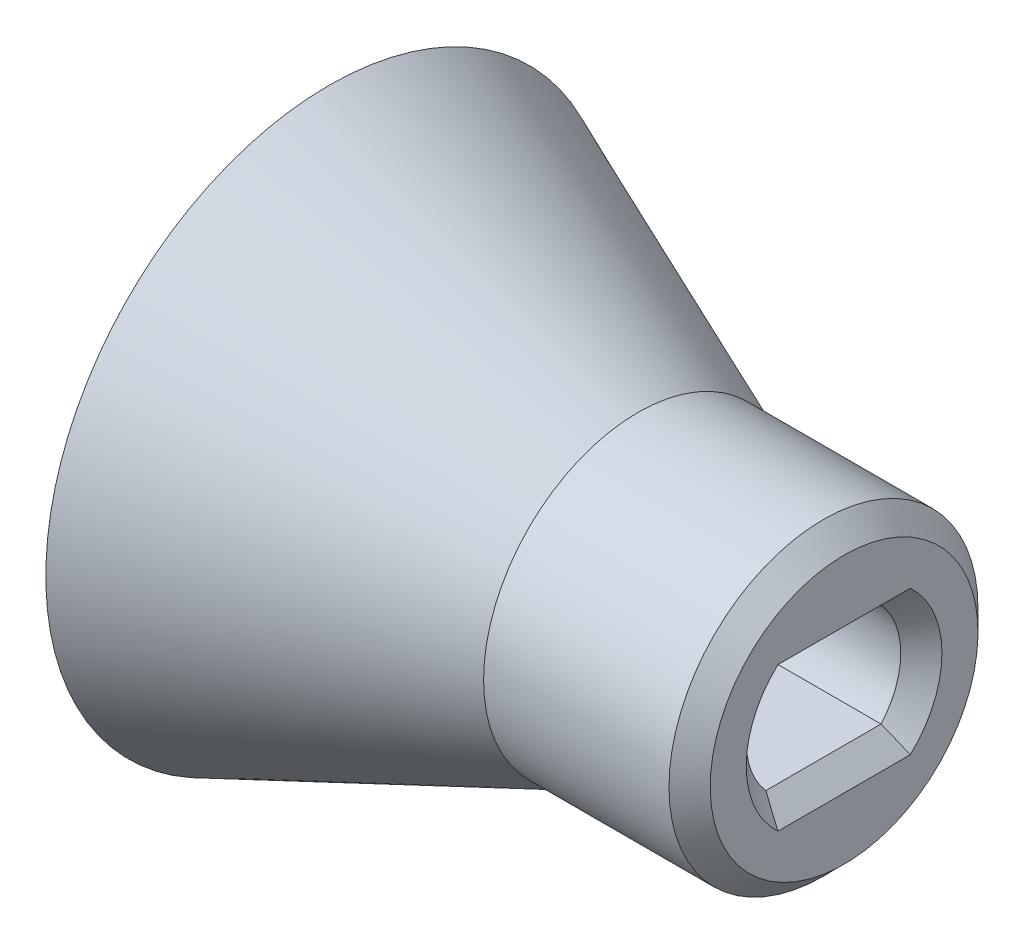
ISO-10303-21;
HEADER;
FILE_DESCRIPTION(('STEP AP214'),'2;1');
FILE_NAME('part.step','',(''),(''),'','','');
FILE_SCHEMA(('AUTOMOTIVE_DESIGN { 1 0 10303 214 1 1 1 1 }'));
ENDSEC;
DATA;
#1=APPLICATION_CONTEXT('core data for automotive mechanical design processes');
#2=APPLICATION_PROTOCOL_DEFINITION('international standard','automotive_design',2000,#1);
#3=PRODUCT_CONTEXT('',#1,'mechanical');
#4=PRODUCT('Part','Part','',(#3));
#5=PRODUCT_RELATED_PRODUCT_CATEGORY('part','',(#4));
#6=PRODUCT_DEFINITION_FORMATION('','',#4);
#7=PRODUCT_DEFINITION_CONTEXT('part definition',#1,'design');
#8=PRODUCT_DEFINITION('design','',#6,#7);
#9=PRODUCT_DEFINITION_SHAPE('','',#8);
#10=(LENGTH_UNIT() NAMED_UNIT(*) SI_UNIT(.MILLI.,.METRE.));
#11=(NAMED_UNIT(*) PLANE_ANGLE_UNIT() SI_UNIT($,.RADIAN.));
#12=(NAMED_UNIT(*) SI_UNIT($,.STERADIAN.) SOLID_ANGLE_UNIT());
#13=UNCERTAINTY_MEASURE_WITH_UNIT(LENGTH_MEASURE(1.E-05),#10,'distance_accuracy_value','');
#14=(GEOMETRIC_REPRESENTATION_CONTEXT(3) GLOBAL_UNCERTAINTY_ASSIGNED_CONTEXT((#13)) GLOBAL_UNIT_ASSIGNED_CONTEXT((#10,
#11,#12)) REPRESENTATION_CONTEXT('',''));
#15=CARTESIAN_POINT('',(0.,0.,0.));
#16=DIRECTION('',(0.,0.,1.));
#17=DIRECTION('',(1.,0.,0.));
#18=AXIS2_PLACEMENT_3D('',#15,#16,#17);
#19=CARTESIAN_POINT('',(0.,0.,0.));
#20=DIRECTION('',(-1.,0.,0.));
#21=DIRECTION('',(0.,-1.,0.));
#22=AXIS2_PLACEMENT_3D('',#19,#20,#21);
#23=PLANE('',#22);
#24=CARTESIAN_POINT('',(0.,0.,0.));
#25=DIRECTION('',(1.,0.,0.));
#26=DIRECTION('',(0.,1.,0.));
#27=AXIS2_PLACEMENT_3D('',#24,#25,#26);
#28=CIRCLE('',#27,11.);
#29=CARTESIAN_POINT('',(0.,11.,0.));
#30=VERTEX_POINT('',#29);
#31=EDGE_CURVE('E132',#30,#30,#28,.T.);
#32=ORIENTED_EDGE('',*,*,#31,.F.);
#33=EDGE_LOOP('',(#32));
#34=FACE_BOUND('',#33,.T.);
#35=ADVANCED_FACE('F35',(#34),#23,.T.);
#36=CARTESIAN_POINT('',(12.,0.,0.));
#37=DIRECTION('',(-1.,0.,0.));
#38=DIRECTION('',(0.,-1.,0.));
#39=AXIS2_PLACEMENT_3D('',#36,#37,#38);
#40=CONICAL_SURFACE('',#39,6.,0.394791119699761);
#41=ORIENTED_EDGE('',*,*,#31,.T.);
#42=EDGE_LOOP('',(#41));
#43=FACE_BOUND('',#42,.T.);
#44=CARTESIAN_POINT('',(12.,0.,0.));
#45=DIRECTION('',(1.,0.,0.));
#46=DIRECTION('',(0.,1.,0.));
#47=AXIS2_PLACEMENT_3D('',#44,#45,#46);
#48=CIRCLE('',#47,6.);
#49=CARTESIAN_POINT('',(12.,6.,0.));
#50=VERTEX_POINT('',#49);
#51=EDGE_CURVE('E126',#50,#50,#48,.T.);
#52=ORIENTED_EDGE('',*,*,#51,.F.);
#53=EDGE_LOOP('',(#52));
#54=FACE_BOUND('',#53,.T.);
#55=ADVANCED_FACE('F201',(#43,#54),#40,.T.);
#56=CARTESIAN_POINT('',(20.,0.,0.));
#57=DIRECTION('',(1.,0.,0.));
#58=DIRECTION('',(0.,1.,0.));
#59=AXIS2_PLACEMENT_3D('',#56,#57,#58);
#60=CYLINDRICAL_SURFACE('',#59,6.);
#61=CARTESIAN_POINT('',(19.2,0.,0.));
#62=DIRECTION('',(1.,0.,0.));
#63=DIRECTION('',(0.,1.,0.));
#64=AXIS2_PLACEMENT_3D('',#61,#62,#63);
#65=CIRCLE('',#64,6.);
#66=CARTESIAN_POINT('',(19.2,6.,0.));
#67=VERTEX_POINT('',#66);
#68=EDGE_CURVE('E11',#67,#67,#65,.F.);
#69=ORIENTED_EDGE('',*,*,#68,.T.);
#70=EDGE_LOOP('',(#69));
#71=FACE_BOUND('',#70,.T.);
#72=ORIENTED_EDGE('',*,*,#51,.T.);
#73=EDGE_LOOP('',(#72));
#74=FACE_BOUND('',#73,.T.);
#75=ADVANCED_FACE('F206',(#71,#74),#60,.T.);
#76=CARTESIAN_POINT('',(20.,6.,0.));
#77=DIRECTION('',(1.,0.,0.));
#78=DIRECTION('',(0.,1.,0.));
#79=AXIS2_PLACEMENT_3D('',#76,#77,#78);
#80=PLANE('',#79);
#81=DIRECTION('',(0.,0.,1.));
#82=VECTOR('',#81,1.);
#83=CARTESIAN_POINT('',(20.,-2.8,2.23606797749979));
#84=LINE('',#83,#82);
#85=CARTESIAN_POINT('',(20.,-2.8,-2.56904651573303));
#86=VERTEX_POINT('',#85);
#87=CARTESIAN_POINT('',(20.,-2.8,2.56904651573303));
#88=VERTEX_POINT('',#87);
#89=EDGE_CURVE('E139',#86,#88,#84,.T.);
#90=ORIENTED_EDGE('',*,*,#89,.T.);
#91=CARTESIAN_POINT('',(20.,0.,0.));
#92=DIRECTION('',(1.,0.,0.));
#93=DIRECTION('',(0.,1.,0.));
#94=AXIS2_PLACEMENT_3D('',#91,#92,#93);
#95=CIRCLE('',#94,3.8);
#96=CARTESIAN_POINT('',(20.,2.8,2.56904651573303));
#97=VERTEX_POINT('',#96);
#98=EDGE_CURVE('E145',#88,#97,#95,.F.);
#99=ORIENTED_EDGE('',*,*,#98,.T.);
#100=DIRECTION('',(0.,0.,-1.));
#101=VECTOR('',#100,1.);
#102=CARTESIAN_POINT('',(20.,2.8,-2.23606797749979));
#103=LINE('',#102,#101);
#104=CARTESIAN_POINT('',(20.,2.8,-2.56904651573303));
#105=VERTEX_POINT('',#104);
#106=EDGE_CURVE('E143',#97,#105,#103,.T.);
#107=ORIENTED_EDGE('',*,*,#106,.T.);
#108=CARTESIAN_POINT('',(20.,0.,0.));
#109=DIRECTION('',(1.,0.,0.));
#110=DIRECTION('',(0.,1.,0.));
#111=AXIS2_PLACEMENT_3D('',#108,#109,#110);
#112=CIRCLE('',#111,3.8);
#113=EDGE_CURVE('E141',#105,#86,#112,.F.);
#114=ORIENTED_EDGE('',*,*,#113,.T.);
#115=EDGE_LOOP('',(#90,#99,#107,#114));
#116=FACE_BOUND('',#115,.T.);
#117=CARTESIAN_POINT('',(20.,0.,0.));
#118=DIRECTION('',(1.,0.,0.));
#119=DIRECTION('',(0.,1.,0.));
#120=AXIS2_PLACEMENT_3D('',#117,#118,#119);
#121=CIRCLE('',#120,5.2);
#122=CARTESIAN_POINT('',(20.,5.2,0.));
#123=VERTEX_POINT('',#122);
#124=EDGE_CURVE('E136',#123,#123,#121,.T.);
#125=ORIENTED_EDGE('',*,*,#124,.T.);
#126=EDGE_LOOP('',(#125));
#127=FACE_BOUND('',#126,.T.);
#128=ADVANCED_FACE('F213',(#116,#127),#80,.T.);
#129=CARTESIAN_POINT('',(12.,0.,0.));
#130=DIRECTION('',(1.,0.,0.));
#131=DIRECTION('',(0.,0.,-1.));
#132=AXIS2_PLACEMENT_3D('',#129,#130,#131);
#133=CYLINDRICAL_SURFACE('',#132,3.);
#134=DIRECTION('',(1.,0.,0.));
#135=VECTOR('',#134,1.);
#136=CARTESIAN_POINT('',(12.,2.,2.23606797749979));
#137=LINE('',#136,#135);
#138=CARTESIAN_POINT('',(12.,2.,2.23606797749979));
#139=VERTEX_POINT('',#138);
#140=CARTESIAN_POINT('',(19.2,2.,2.23606797749979));
#141=VERTEX_POINT('',#140);
#142=EDGE_CURVE('E124',#139,#141,#137,.T.);
#143=ORIENTED_EDGE('',*,*,#142,.T.);
#144=CARTESIAN_POINT('',(19.2,0.,0.));
#145=DIRECTION('',(1.,0.,0.));
#146=DIRECTION('',(0.,0.,-1.));
#147=AXIS2_PLACEMENT_3D('',#144,#145,#146);
#148=CIRCLE('',#147,3.);
#149=CARTESIAN_POINT('',(19.2,-2.,2.23606797749979));
#150=VERTEX_POINT('',#149);
#151=EDGE_CURVE('E104',#141,#150,#148,.T.);
#152=ORIENTED_EDGE('',*,*,#151,.T.);
#153=DIRECTION('',(1.,0.,0.));
#154=VECTOR('',#153,1.);
#155=CARTESIAN_POINT('',(12.,-2.,2.23606797749979));
#156=LINE('',#155,#154);
#157=CARTESIAN_POINT('',(12.,-2.,2.23606797749979));
#158=VERTEX_POINT('',#157);
#159=EDGE_CURVE('E96',#158,#150,#156,.T.);
#160=ORIENTED_EDGE('',*,*,#159,.F.);
#161=CARTESIAN_POINT('',(12.,0.,0.));
#162=DIRECTION('',(1.,0.,0.));
#163=DIRECTION('',(0.,0.,-1.));
#164=AXIS2_PLACEMENT_3D('',#161,#162,#163);
#165=CIRCLE('',#164,3.);
#166=EDGE_CURVE('E101',#139,#158,#165,.T.);
#167=ORIENTED_EDGE('',*,*,#166,.F.);
#168=EDGE_LOOP('',(#143,#152,#160,#167));
#169=FACE_BOUND('',#168,.T.);
#170=ADVANCED_FACE('F99',(#169),#133,.F.);
#171=CARTESIAN_POINT('',(12.,2.,2.23606797749979));
#172=DIRECTION('',(0.,1.,0.));
#173=DIRECTION('',(0.,0.,1.));
#174=AXIS2_PLACEMENT_3D('',#171,#172,#173);
#175=PLANE('',#174);
#176=DIRECTION('',(1.,0.,0.));
#177=VECTOR('',#176,1.);
#178=CARTESIAN_POINT('',(12.,2.,-2.23606797749979));
#179=LINE('',#178,#177);
#180=CARTESIAN_POINT('',(12.,2.,-2.23606797749979));
#181=VERTEX_POINT('',#180);
#182=CARTESIAN_POINT('',(19.2,2.,-2.23606797749979));
#183=VERTEX_POINT('',#182);
#184=EDGE_CURVE('E127',#181,#183,#179,.T.);
#185=ORIENTED_EDGE('',*,*,#184,.T.);
#186=DIRECTION('',(0.,0.,1.));
#187=VECTOR('',#186,1.);
#188=CARTESIAN_POINT('',(19.2,2.,2.23606797749979));
#189=LINE('',#188,#187);
#190=EDGE_CURVE('E148',#183,#141,#189,.T.);
#191=ORIENTED_EDGE('',*,*,#190,.T.);
#192=ORIENTED_EDGE('',*,*,#142,.F.);
#193=DIRECTION('',(0.,0.,1.));
#194=VECTOR('',#193,1.);
#195=CARTESIAN_POINT('',(12.,2.,2.23606797749979));
#196=LINE('',#195,#194);
#197=EDGE_CURVE('E106',#181,#139,#196,.T.);
#198=ORIENTED_EDGE('',*,*,#197,.F.);
#199=EDGE_LOOP('',(#185,#191,#192,#198));
#200=FACE_BOUND('',#199,.T.);
#201=ADVANCED_FACE('F220',(#200),#175,.F.);
#202=CARTESIAN_POINT('',(12.,0.,0.));
#203=DIRECTION('',(1.,0.,0.));
#204=DIRECTION('',(0.,0.,-1.));
#205=AXIS2_PLACEMENT_3D('',#202,#203,#204);
#206=CYLINDRICAL_SURFACE('',#205,3.);
#207=DIRECTION('',(1.,0.,0.));
#208=VECTOR('',#207,1.);
#209=CARTESIAN_POINT('',(12.,-2.,-2.23606797749979));
#210=LINE('',#209,#208);
#211=CARTESIAN_POINT('',(12.,-2.,-2.23606797749979));
#212=VERTEX_POINT('',#211);
#213=CARTESIAN_POINT('',(19.2,-2.,-2.23606797749979));
#214=VERTEX_POINT('',#213);
#215=EDGE_CURVE('E105',#212,#214,#210,.T.);
#216=ORIENTED_EDGE('',*,*,#215,.T.);
#217=CARTESIAN_POINT('',(19.2,0.,0.));
#218=DIRECTION('',(1.,0.,0.));
#219=DIRECTION('',(0.,0.,-1.));
#220=AXIS2_PLACEMENT_3D('',#217,#218,#219);
#221=CIRCLE('',#220,3.);
#222=EDGE_CURVE('E64',#214,#183,#221,.T.);
#223=ORIENTED_EDGE('',*,*,#222,.T.);
#224=ORIENTED_EDGE('',*,*,#184,.F.);
#225=CARTESIAN_POINT('',(12.,0.,0.));
#226=DIRECTION('',(1.,0.,0.));
#227=DIRECTION('',(0.,0.,-1.));
#228=AXIS2_PLACEMENT_3D('',#225,#226,#227);
#229=CIRCLE('',#228,3.);
#230=EDGE_CURVE('E114',#212,#181,#229,.T.);
#231=ORIENTED_EDGE('',*,*,#230,.F.);
#232=EDGE_LOOP('',(#216,#223,#224,#231));
#233=FACE_BOUND('',#232,.T.);
#234=ADVANCED_FACE('F223',(#233),#206,.F.);
#235=CARTESIAN_POINT('',(12.,-2.,2.23606797749979));
#236=DIRECTION('',(0.,-1.,0.));
#237=DIRECTION('',(0.,0.,-1.));
#238=AXIS2_PLACEMENT_3D('',#235,#236,#237);
#239=PLANE('',#238);
#240=ORIENTED_EDGE('',*,*,#159,.T.);
#241=DIRECTION('',(0.,0.,-1.));
#242=VECTOR('',#241,1.);
#243=CARTESIAN_POINT('',(19.2,-2.,-2.23606797749979));
#244=LINE('',#243,#242);
#245=EDGE_CURVE('E50',#150,#214,#244,.T.);
#246=ORIENTED_EDGE('',*,*,#245,.T.);
#247=ORIENTED_EDGE('',*,*,#215,.F.);
#248=DIRECTION('',(0.,0.,-1.));
#249=VECTOR('',#248,1.);
#250=CARTESIAN_POINT('',(12.,-2.,2.23606797749979));
#251=LINE('',#250,#249);
#252=EDGE_CURVE('E109',#158,#212,#251,.T.);
#253=ORIENTED_EDGE('',*,*,#252,.F.);
#254=EDGE_LOOP('',(#240,#246,#247,#253));
#255=FACE_BOUND('',#254,.T.);
#256=ADVANCED_FACE('F110',(#255),#239,.F.);
#257=CARTESIAN_POINT('',(12.,0.,0.));
#258=DIRECTION('',(1.,0.,0.));
#259=DIRECTION('',(0.,0.,-1.));
#260=AXIS2_PLACEMENT_3D('',#257,#258,#259);
#261=PLANE('',#260);
#262=ORIENTED_EDGE('',*,*,#166,.T.);
#263=ORIENTED_EDGE('',*,*,#252,.T.);
#264=ORIENTED_EDGE('',*,*,#230,.T.);
#265=ORIENTED_EDGE('',*,*,#197,.T.);
#266=EDGE_LOOP('',(#262,#263,#264,#265));
#267=FACE_BOUND('',#266,.T.);
#268=ADVANCED_FACE('F116',(#267),#261,.T.);
#269=CARTESIAN_POINT('',(19.2,0.,0.));
#270=DIRECTION('',(1.,0.,0.));
#271=DIRECTION('',(0.,0.,-1.));
#272=AXIS2_PLACEMENT_3D('',#269,#270,#271);
#273=CONICAL_SURFACE('',#272,3.,0.78539816339745);
#274=CARTESIAN_POINT('',(20.,-2.8,-2.56904651573303));
#275=CARTESIAN_POINT('',(19.9329921327895,-2.73299213278948,-2.54296193439734));
#276=CARTESIAN_POINT('',(19.8660550495393,-2.66605504953929,-2.5165112686128));
#277=CARTESIAN_POINT('',(19.7323484964138,-2.53234849641375,-2.46280737789159));
#278=CARTESIAN_POINT('',(19.6655790123103,-2.46557901231026,-2.43555422376699));
#279=CARTESIAN_POINT('',(19.5322202447242,-2.33222024472424,-2.38016971227914));
#280=CARTESIAN_POINT('',(19.4656309657712,-2.26563096577124,-2.35203833306005));
#281=CARTESIAN_POINT('',(19.3326552008093,-2.13265520080934,-2.29480410731906));
#282=CARTESIAN_POINT('',(19.2662687331752,-2.06626873317519,-2.26570117546595));
#283=CARTESIAN_POINT('',(19.2,-2.,-2.23606797749979));
#284=B_SPLINE_CURVE_WITH_KNOTS('',3,(#274,#275,#276,#277,#278,#279,#280,#281,#282,#283),
.UNSPECIFIED.,.F.,.F.,(4,2,2,2,4),(0.,0.294863921129976,0.589701900800756,0.884547223783687,
1.17941851144165),.UNSPECIFIED.);
#285=EDGE_CURVE('E120',#86,#214,#284,.T.);
#286=ORIENTED_EDGE('',*,*,#285,.F.);
#287=ORIENTED_EDGE('',*,*,#113,.F.);
#288=CARTESIAN_POINT('',(20.,2.8,-2.56904651573303));
#289=CARTESIAN_POINT('',(19.9329921327895,2.73299213278948,-2.54296193439734));
#290=CARTESIAN_POINT('',(19.8660550495393,2.66605504953929,-2.5165112686128));
#291=CARTESIAN_POINT('',(19.7323484964138,2.53234849641376,-2.46280737789159));
#292=CARTESIAN_POINT('',(19.6655790123103,2.46557901231027,-2.43555422376699));
#293=CARTESIAN_POINT('',(19.5322202447242,2.33222024472424,-2.38016971227914));
#294=CARTESIAN_POINT('',(19.4656309657712,2.26563096577125,-2.35203833306005));
#295=CARTESIAN_POINT('',(19.3326552008093,2.13265520080935,-2.29480410731906));
#296=CARTESIAN_POINT('',(19.2662687331752,2.06626873317519,-2.26570117546595));
#297=CARTESIAN_POINT('',(19.2,2.,-2.23606797749979));
#298=B_SPLINE_CURVE_WITH_KNOTS('',3,(#288,#289,#290,#291,#292,#293,#294,#295,#296,#297),
.UNSPECIFIED.,.F.,.F.,(4,2,2,2,4),(0.,0.294863921129976,0.589701900800756,0.884547223783686,
1.17941851144165),.UNSPECIFIED.);
#299=EDGE_CURVE('E40',#183,#105,#298,.F.);
#300=ORIENTED_EDGE('',*,*,#299,.F.);
#301=ORIENTED_EDGE('',*,*,#222,.F.);
#302=EDGE_LOOP('',(#286,#287,#300,#301));
#303=FACE_BOUND('',#302,.T.);
#304=ADVANCED_FACE('F186',(#303),#273,.F.);
#305=CARTESIAN_POINT('',(19.2,2.,2.23606797749979));
#306=DIRECTION('',(0.707106781186549,-0.707106781186546,0.));
#307=DIRECTION('',(0.,0.,-1.));
#308=AXIS2_PLACEMENT_3D('',#305,#306,#307);
#309=PLANE('',#308);
#310=ORIENTED_EDGE('',*,*,#299,.T.);
#311=ORIENTED_EDGE('',*,*,#106,.F.);
#312=CARTESIAN_POINT('',(20.,2.8,2.56904651573303));
#313=CARTESIAN_POINT('',(19.9329921327895,2.73299213278948,2.54296193439734));
#314=CARTESIAN_POINT('',(19.8660550495393,2.66605504953929,2.5165112686128));
#315=CARTESIAN_POINT('',(19.7323484964138,2.53234849641376,2.46280737789159));
#316=CARTESIAN_POINT('',(19.6655790123103,2.46557901231027,2.43555422376699));
#317=CARTESIAN_POINT('',(19.5322202447242,2.33222024472424,2.38016971227914));
#318=CARTESIAN_POINT('',(19.4656309657712,2.26563096577125,2.35203833306005));
#319=CARTESIAN_POINT('',(19.3326552008093,2.13265520080935,2.29480410731906));
#320=CARTESIAN_POINT('',(19.2662687331752,2.06626873317519,2.26570117546596));
#321=CARTESIAN_POINT('',(19.2,2.,2.23606797749979));
#322=B_SPLINE_CURVE_WITH_KNOTS('',3,(#312,#313,#314,#315,#316,#317,#318,#319,#320,#321),
.UNSPECIFIED.,.F.,.F.,(4,2,2,2,4),(0.,0.294863921129976,0.589701900800756,0.884547223783686,
1.17941851144165),.UNSPECIFIED.);
#323=EDGE_CURVE('E160',#141,#97,#322,.F.);
#324=ORIENTED_EDGE('',*,*,#323,.F.);
#325=ORIENTED_EDGE('',*,*,#190,.F.);
#326=EDGE_LOOP('',(#310,#311,#324,#325));
#327=FACE_BOUND('',#326,.T.);
#328=ADVANCED_FACE('F176',(#327),#309,.T.);
#329=CARTESIAN_POINT('',(19.2,-2.,2.23606797749979));
#330=DIRECTION('',(0.707106781186549,0.707106781186546,0.));
#331=DIRECTION('',(0.,0.,1.));
#332=AXIS2_PLACEMENT_3D('',#329,#330,#331);
#333=PLANE('',#332);
#334=ORIENTED_EDGE('',*,*,#285,.T.);
#335=ORIENTED_EDGE('',*,*,#245,.F.);
#336=CARTESIAN_POINT('',(19.2,-2.,2.23606797749979));
#337=CARTESIAN_POINT('',(19.2662687331752,-2.06626873317519,2.26570117546595));
#338=CARTESIAN_POINT('',(19.3326552008093,-2.13265520080934,2.29480410731906));
#339=CARTESIAN_POINT('',(19.4656309657712,-2.26563096577124,2.35203833306005));
#340=CARTESIAN_POINT('',(19.5322202447242,-2.33222024472424,2.38016971227914));
#341=CARTESIAN_POINT('',(19.6655790123103,-2.46557901231026,2.43555422376699));
#342=CARTESIAN_POINT('',(19.7323484964138,-2.53234849641375,2.46280737789159));
#343=CARTESIAN_POINT('',(19.8660550495393,-2.66605504953929,2.5165112686128));
#344=CARTESIAN_POINT('',(19.9329921327895,-2.73299213278948,2.54296193439734));
#345=CARTESIAN_POINT('',(20.,-2.8,2.56904651573303));
#346=B_SPLINE_CURVE_WITH_KNOTS('',3,(#336,#337,#338,#339,#340,#341,#342,#343,#344,#345),
.UNSPECIFIED.,.F.,.F.,(4,2,2,2,4),(0.,0.294871287657963,0.589716610640894,0.884554590311673,
1.17941851144165),.UNSPECIFIED.);
#347=EDGE_CURVE('E152',#88,#150,#346,.F.);
#348=ORIENTED_EDGE('',*,*,#347,.F.);
#349=ORIENTED_EDGE('',*,*,#89,.F.);
#350=EDGE_LOOP('',(#334,#335,#348,#349));
#351=FACE_BOUND('',#350,.T.);
#352=ADVANCED_FACE('F170',(#351),#333,.T.);
#353=CARTESIAN_POINT('',(19.2,0.,0.));
#354=DIRECTION('',(1.,0.,0.));
#355=DIRECTION('',(0.,0.,-1.));
#356=AXIS2_PLACEMENT_3D('',#353,#354,#355);
#357=CONICAL_SURFACE('',#356,3.,0.78539816339745);
#358=ORIENTED_EDGE('',*,*,#323,.T.);
#359=ORIENTED_EDGE('',*,*,#98,.F.);
#360=ORIENTED_EDGE('',*,*,#347,.T.);
#361=ORIENTED_EDGE('',*,*,#151,.F.);
#362=EDGE_LOOP('',(#358,#359,#360,#361));
#363=FACE_BOUND('',#362,.T.);
#364=ADVANCED_FACE('F166',(#363),#357,.F.);
#365=CARTESIAN_POINT('',(20.,0.,0.));
#366=DIRECTION('',(-1.,0.,0.));
#367=DIRECTION('',(0.,-1.,0.));
#368=AXIS2_PLACEMENT_3D('',#365,#366,#367);
#369=CONICAL_SURFACE('',#368,5.2,0.785398163397448);
#370=ORIENTED_EDGE('',*,*,#68,.F.);
#371=EDGE_LOOP('',(#370));
#372=FACE_BOUND('',#371,.T.);
#373=ORIENTED_EDGE('',*,*,#124,.F.);
#374=EDGE_LOOP('',(#373));
#375=FACE_BOUND('',#374,.T.);
#376=ADVANCED_FACE('F38',(#372,#375),#369,.T.);
#377=CLOSED_SHELL('',(#35,#55,#75,#128,#170,#201,#234,#256,#268,#304,#328,#352,#364,#376));
#378=MANIFOLD_SOLID_BREP('B2',#377);
#379=ADVANCED_BREP_SHAPE_REPRESENTATION('',(#18,#378),#14);
#380=SHAPE_DEFINITION_REPRESENTATION(#9,#379);
ENDSEC;
END-ISO-10303-21;
